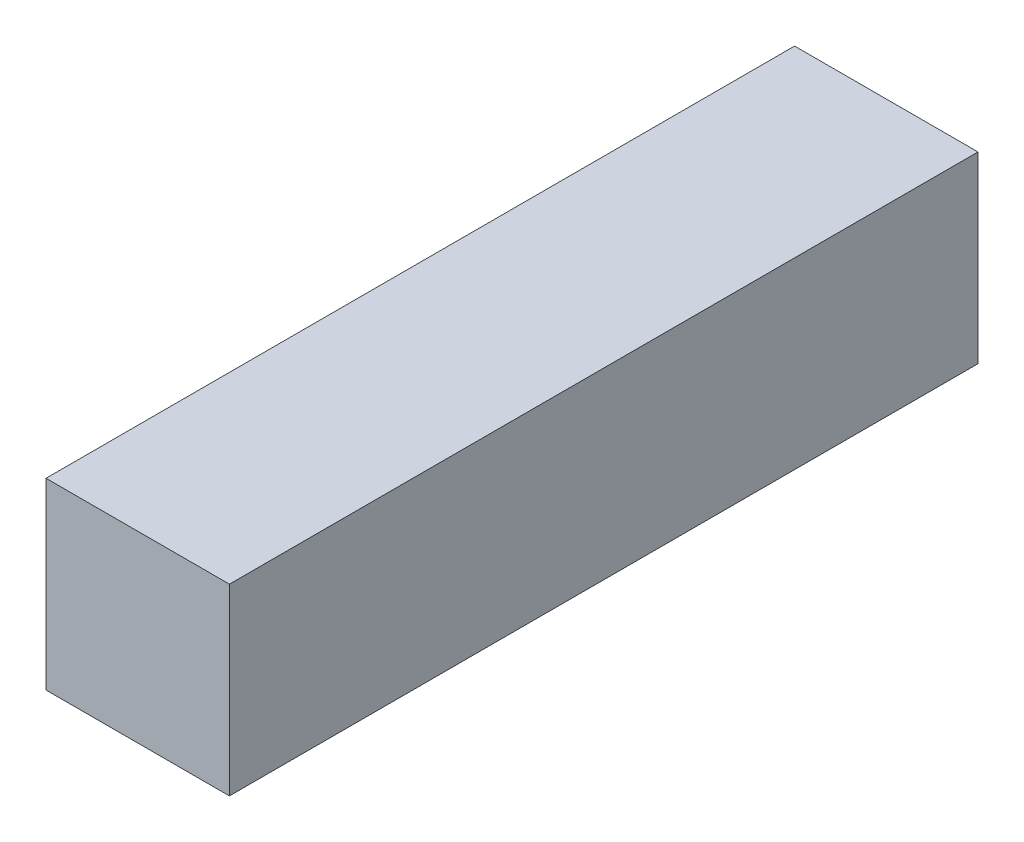
ISO-10303-21;
HEADER;
FILE_DESCRIPTION(('STEP AP214'),'2;1');
FILE_NAME('part.step','',(''),(''),'','','');
FILE_SCHEMA(('AUTOMOTIVE_DESIGN { 1 0 10303 214 1 1 1 1 }'));
ENDSEC;
DATA;
#1=APPLICATION_CONTEXT('core data for automotive mechanical design processes');
#2=APPLICATION_PROTOCOL_DEFINITION('international standard','automotive_design',2000,#1);
#3=PRODUCT_CONTEXT('',#1,'mechanical');
#4=PRODUCT('Part','Part','',(#3));
#5=PRODUCT_RELATED_PRODUCT_CATEGORY('part','',(#4));
#6=PRODUCT_DEFINITION_FORMATION('','',#4);
#7=PRODUCT_DEFINITION_CONTEXT('part definition',#1,'design');
#8=PRODUCT_DEFINITION('design','',#6,#7);
#9=PRODUCT_DEFINITION_SHAPE('','',#8);
#10=(LENGTH_UNIT() NAMED_UNIT(*) SI_UNIT(.MILLI.,.METRE.));
#11=(NAMED_UNIT(*) PLANE_ANGLE_UNIT() SI_UNIT($,.RADIAN.));
#12=(NAMED_UNIT(*) SI_UNIT($,.STERADIAN.) SOLID_ANGLE_UNIT());
#13=UNCERTAINTY_MEASURE_WITH_UNIT(LENGTH_MEASURE(1.E-05),#10,'distance_accuracy_value','');
#14=(GEOMETRIC_REPRESENTATION_CONTEXT(3) GLOBAL_UNCERTAINTY_ASSIGNED_CONTEXT((#13)) GLOBAL_UNIT_ASSIGNED_CONTEXT((#10,
#11,#12)) REPRESENTATION_CONTEXT('',''));
#15=CARTESIAN_POINT('',(0.,0.,0.));
#16=DIRECTION('',(0.,0.,1.));
#17=DIRECTION('',(1.,0.,0.));
#18=AXIS2_PLACEMENT_3D('',#15,#16,#17);
#19=CARTESIAN_POINT('',(2.45,-2.45,20.));
#20=DIRECTION('',(-1.,0.,0.));
#21=DIRECTION('',(0.,0.,1.));
#22=AXIS2_PLACEMENT_3D('',#19,#20,#21);
#23=PLANE('',#22);
#24=DIRECTION('',(0.,1.,0.));
#25=VECTOR('',#24,1.);
#26=CARTESIAN_POINT('',(2.45,-2.45,0.));
#27=LINE('',#26,#25);
#28=CARTESIAN_POINT('',(2.45,-2.45,0.));
#29=VERTEX_POINT('',#28);
#30=CARTESIAN_POINT('',(2.45,2.45,0.));
#31=VERTEX_POINT('',#30);
#32=EDGE_CURVE('E107',#29,#31,#27,.T.);
#33=ORIENTED_EDGE('',*,*,#32,.T.);
#34=DIRECTION('',(0.,0.,-1.));
#35=VECTOR('',#34,1.);
#36=CARTESIAN_POINT('',(2.45,2.45,20.));
#37=LINE('',#36,#35);
#38=CARTESIAN_POINT('',(2.45,2.45,20.));
#39=VERTEX_POINT('',#38);
#40=EDGE_CURVE('E11',#39,#31,#37,.T.);
#41=ORIENTED_EDGE('',*,*,#40,.F.);
#42=DIRECTION('',(0.,1.,0.));
#43=VECTOR('',#42,1.);
#44=CARTESIAN_POINT('',(2.45,-2.45,20.));
#45=LINE('',#44,#43);
#46=CARTESIAN_POINT('',(2.45,-2.45,20.));
#47=VERTEX_POINT('',#46);
#48=EDGE_CURVE('E91',#47,#39,#45,.T.);
#49=ORIENTED_EDGE('',*,*,#48,.F.);
#50=DIRECTION('',(0.,0.,-1.));
#51=VECTOR('',#50,1.);
#52=CARTESIAN_POINT('',(2.45,-2.45,20.));
#53=LINE('',#52,#51);
#54=EDGE_CURVE('E103',#47,#29,#53,.T.);
#55=ORIENTED_EDGE('',*,*,#54,.T.);
#56=EDGE_LOOP('',(#33,#41,#49,#55));
#57=FACE_BOUND('',#56,.T.);
#58=ADVANCED_FACE('F39',(#57),#23,.F.);
#59=CARTESIAN_POINT('',(-2.45,2.45,20.));
#60=DIRECTION('',(0.,-1.,0.));
#61=DIRECTION('',(0.,0.,-1.));
#62=AXIS2_PLACEMENT_3D('',#59,#60,#61);
#63=PLANE('',#62);
#64=DIRECTION('',(-1.,0.,0.));
#65=VECTOR('',#64,1.);
#66=CARTESIAN_POINT('',(-2.45,2.45,0.));
#67=LINE('',#66,#65);
#68=CARTESIAN_POINT('',(-2.45,2.45,0.));
#69=VERTEX_POINT('',#68);
#70=EDGE_CURVE('E96',#31,#69,#67,.T.);
#71=ORIENTED_EDGE('',*,*,#70,.T.);
#72=DIRECTION('',(0.,0.,-1.));
#73=VECTOR('',#72,1.);
#74=CARTESIAN_POINT('',(-2.45,2.45,20.));
#75=LINE('',#74,#73);
#76=CARTESIAN_POINT('',(-2.45,2.45,20.));
#77=VERTEX_POINT('',#76);
#78=EDGE_CURVE('E48',#77,#69,#75,.T.);
#79=ORIENTED_EDGE('',*,*,#78,.F.);
#80=DIRECTION('',(-1.,0.,0.));
#81=VECTOR('',#80,1.);
#82=CARTESIAN_POINT('',(-2.45,2.45,20.));
#83=LINE('',#82,#81);
#84=EDGE_CURVE('E86',#39,#77,#83,.T.);
#85=ORIENTED_EDGE('',*,*,#84,.F.);
#86=ORIENTED_EDGE('',*,*,#40,.T.);
#87=EDGE_LOOP('',(#71,#79,#85,#86));
#88=FACE_BOUND('',#87,.T.);
#89=ADVANCED_FACE('F95',(#88),#63,.F.);
#90=CARTESIAN_POINT('',(-2.45,-2.45,20.));
#91=DIRECTION('',(1.,0.,0.));
#92=DIRECTION('',(0.,0.,-1.));
#93=AXIS2_PLACEMENT_3D('',#90,#91,#92);
#94=PLANE('',#93);
#95=DIRECTION('',(0.,-1.,0.));
#96=VECTOR('',#95,1.);
#97=CARTESIAN_POINT('',(-2.45,-2.45,0.));
#98=LINE('',#97,#96);
#99=CARTESIAN_POINT('',(-2.45,-2.45,0.));
#100=VERTEX_POINT('',#99);
#101=EDGE_CURVE('E73',#69,#100,#98,.T.);
#102=ORIENTED_EDGE('',*,*,#101,.T.);
#103=DIRECTION('',(0.,0.,-1.));
#104=VECTOR('',#103,1.);
#105=CARTESIAN_POINT('',(-2.45,-2.45,20.));
#106=LINE('',#105,#104);
#107=CARTESIAN_POINT('',(-2.45,-2.45,20.));
#108=VERTEX_POINT('',#107);
#109=EDGE_CURVE('E98',#108,#100,#106,.T.);
#110=ORIENTED_EDGE('',*,*,#109,.F.);
#111=DIRECTION('',(0.,-1.,0.));
#112=VECTOR('',#111,1.);
#113=CARTESIAN_POINT('',(-2.45,-2.45,20.));
#114=LINE('',#113,#112);
#115=EDGE_CURVE('E89',#77,#108,#114,.T.);
#116=ORIENTED_EDGE('',*,*,#115,.F.);
#117=ORIENTED_EDGE('',*,*,#78,.T.);
#118=EDGE_LOOP('',(#102,#110,#116,#117));
#119=FACE_BOUND('',#118,.T.);
#120=ADVANCED_FACE('F99',(#119),#94,.F.);
#121=CARTESIAN_POINT('',(-2.45,-2.45,20.));
#122=DIRECTION('',(0.,1.,0.));
#123=DIRECTION('',(0.,0.,1.));
#124=AXIS2_PLACEMENT_3D('',#121,#122,#123);
#125=PLANE('',#124);
#126=DIRECTION('',(1.,0.,0.));
#127=VECTOR('',#126,1.);
#128=CARTESIAN_POINT('',(-2.45,-2.45,0.));
#129=LINE('',#128,#127);
#130=EDGE_CURVE('E79',#100,#29,#129,.T.);
#131=ORIENTED_EDGE('',*,*,#130,.T.);
#132=ORIENTED_EDGE('',*,*,#54,.F.);
#133=DIRECTION('',(1.,0.,0.));
#134=VECTOR('',#133,1.);
#135=CARTESIAN_POINT('',(-2.45,-2.45,20.));
#136=LINE('',#135,#134);
#137=EDGE_CURVE('E56',#108,#47,#136,.T.);
#138=ORIENTED_EDGE('',*,*,#137,.F.);
#139=ORIENTED_EDGE('',*,*,#109,.T.);
#140=EDGE_LOOP('',(#131,#132,#138,#139));
#141=FACE_BOUND('',#140,.T.);
#142=ADVANCED_FACE('F120',(#141),#125,.F.);
#143=CARTESIAN_POINT('',(0.,0.,20.));
#144=DIRECTION('',(0.,0.,-1.));
#145=DIRECTION('',(-1.,0.,0.));
#146=AXIS2_PLACEMENT_3D('',#143,#144,#145);
#147=PLANE('',#146);
#148=ORIENTED_EDGE('',*,*,#48,.T.);
#149=ORIENTED_EDGE('',*,*,#84,.T.);
#150=ORIENTED_EDGE('',*,*,#115,.T.);
#151=ORIENTED_EDGE('',*,*,#137,.T.);
#152=EDGE_LOOP('',(#148,#149,#150,#151));
#153=FACE_BOUND('',#152,.T.);
#154=ADVANCED_FACE('F87',(#153),#147,.F.);
#155=CARTESIAN_POINT('',(0.,0.,0.));
#156=DIRECTION('',(0.,0.,-1.));
#157=DIRECTION('',(-1.,0.,0.));
#158=AXIS2_PLACEMENT_3D('',#155,#156,#157);
#159=PLANE('',#158);
#160=ORIENTED_EDGE('',*,*,#32,.F.);
#161=ORIENTED_EDGE('',*,*,#130,.F.);
#162=ORIENTED_EDGE('',*,*,#101,.F.);
#163=ORIENTED_EDGE('',*,*,#70,.F.);
#164=EDGE_LOOP('',(#160,#161,#162,#163));
#165=FACE_BOUND('',#164,.T.);
#166=ADVANCED_FACE('F123',(#165),#159,.T.);
#167=CLOSED_SHELL('',(#58,#89,#120,#142,#154,#166));
#168=MANIFOLD_SOLID_BREP('B2',#167);
#169=ADVANCED_BREP_SHAPE_REPRESENTATION('',(#18,#168),#14);
#170=SHAPE_DEFINITION_REPRESENTATION(#9,#169);
ENDSEC;
END-ISO-10303-21;
